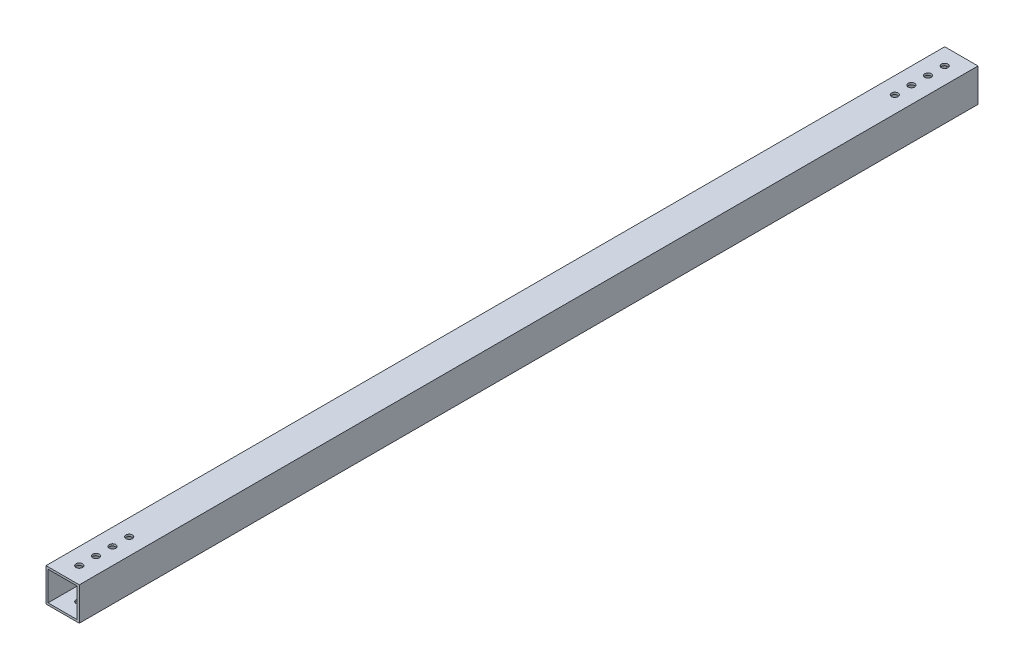
ISO-10303-21;
HEADER;
FILE_DESCRIPTION(('STEP AP214'),'2;1');
FILE_NAME('part.step','',(''),(''),'','','');
FILE_SCHEMA(('AUTOMOTIVE_DESIGN { 1 0 10303 214 1 1 1 1 }'));
ENDSEC;
DATA;
#1=APPLICATION_CONTEXT('core data for automotive mechanical design processes');
#2=APPLICATION_PROTOCOL_DEFINITION('international standard','automotive_design',2000,#1);
#3=PRODUCT_CONTEXT('',#1,'mechanical');
#4=PRODUCT('Part','Part','',(#3));
#5=PRODUCT_RELATED_PRODUCT_CATEGORY('part','',(#4));
#6=PRODUCT_DEFINITION_FORMATION('','',#4);
#7=PRODUCT_DEFINITION_CONTEXT('part definition',#1,'design');
#8=PRODUCT_DEFINITION('design','',#6,#7);
#9=PRODUCT_DEFINITION_SHAPE('','',#8);
#10=(LENGTH_UNIT() NAMED_UNIT(*) SI_UNIT(.MILLI.,.METRE.));
#11=(NAMED_UNIT(*) PLANE_ANGLE_UNIT() SI_UNIT($,.RADIAN.));
#12=(NAMED_UNIT(*) SI_UNIT($,.STERADIAN.) SOLID_ANGLE_UNIT());
#13=UNCERTAINTY_MEASURE_WITH_UNIT(LENGTH_MEASURE(1.E-05),#10,'distance_accuracy_value','');
#14=(GEOMETRIC_REPRESENTATION_CONTEXT(3) GLOBAL_UNCERTAINTY_ASSIGNED_CONTEXT((#13)) GLOBAL_UNIT_ASSIGNED_CONTEXT((#10,
#11,#12)) REPRESENTATION_CONTEXT('',''));
#15=CARTESIAN_POINT('',(0.,0.,0.));
#16=DIRECTION('',(0.,0.,1.));
#17=DIRECTION('',(1.,0.,0.));
#18=AXIS2_PLACEMENT_3D('',#15,#16,#17);
#19=CARTESIAN_POINT('',(0.,0.,342.9));
#20=DIRECTION('',(0.,0.,-1.));
#21=DIRECTION('',(-1.,0.,0.));
#22=AXIS2_PLACEMENT_3D('',#19,#20,#21);
#23=PLANE('',#22);
#24=DIRECTION('',(0.,1.,0.));
#25=VECTOR('',#24,1.);
#26=CARTESIAN_POINT('',(12.7,-12.7,342.9));
#27=LINE('',#26,#25);
#28=CARTESIAN_POINT('',(12.7,-12.7,342.9));
#29=VERTEX_POINT('',#28);
#30=CARTESIAN_POINT('',(12.7,12.7,342.9));
#31=VERTEX_POINT('',#30);
#32=EDGE_CURVE('E157',#29,#31,#27,.T.);
#33=ORIENTED_EDGE('',*,*,#32,.T.);
#34=DIRECTION('',(-1.,0.,0.));
#35=VECTOR('',#34,1.);
#36=CARTESIAN_POINT('',(-12.7,12.7,342.9));
#37=LINE('',#36,#35);
#38=CARTESIAN_POINT('',(-12.7,12.7,342.9));
#39=VERTEX_POINT('',#38);
#40=EDGE_CURVE('E161',#31,#39,#37,.T.);
#41=ORIENTED_EDGE('',*,*,#40,.T.);
#42=DIRECTION('',(0.,-1.,0.));
#43=VECTOR('',#42,1.);
#44=CARTESIAN_POINT('',(-12.7,-12.7,342.9));
#45=LINE('',#44,#43);
#46=CARTESIAN_POINT('',(-12.7,-12.7,342.9));
#47=VERTEX_POINT('',#46);
#48=EDGE_CURVE('E165',#39,#47,#45,.T.);
#49=ORIENTED_EDGE('',*,*,#48,.T.);
#50=DIRECTION('',(1.,0.,0.));
#51=VECTOR('',#50,1.);
#52=CARTESIAN_POINT('',(-12.7,-12.7,342.9));
#53=LINE('',#52,#51);
#54=EDGE_CURVE('E168',#47,#29,#53,.T.);
#55=ORIENTED_EDGE('',*,*,#54,.T.);
#56=EDGE_LOOP('',(#33,#41,#49,#55));
#57=FACE_BOUND('',#56,.T.);
#58=DIRECTION('',(0.,1.,0.));
#59=VECTOR('',#58,1.);
#60=CARTESIAN_POINT('',(11.1125,0.,342.9));
#61=LINE('',#60,#59);
#62=CARTESIAN_POINT('',(11.1125,-11.1125,342.9));
#63=VERTEX_POINT('',#62);
#64=CARTESIAN_POINT('',(11.1125,11.1125,342.9));
#65=VERTEX_POINT('',#64);
#66=EDGE_CURVE('E138',#63,#65,#61,.T.);
#67=ORIENTED_EDGE('',*,*,#66,.F.);
#68=DIRECTION('',(1.,0.,0.));
#69=VECTOR('',#68,1.);
#70=CARTESIAN_POINT('',(0.,-11.1125,342.9));
#71=LINE('',#70,#69);
#72=CARTESIAN_POINT('',(-11.1125,-11.1125,342.9));
#73=VERTEX_POINT('',#72);
#74=EDGE_CURVE('E119',#73,#63,#71,.T.);
#75=ORIENTED_EDGE('',*,*,#74,.F.);
#76=DIRECTION('',(0.,-1.,0.));
#77=VECTOR('',#76,1.);
#78=CARTESIAN_POINT('',(-11.1125,0.,342.9));
#79=LINE('',#78,#77);
#80=CARTESIAN_POINT('',(-11.1125,11.1125,342.9));
#81=VERTEX_POINT('',#80);
#82=EDGE_CURVE('E152',#81,#73,#79,.T.);
#83=ORIENTED_EDGE('',*,*,#82,.F.);
#84=DIRECTION('',(-1.,0.,0.));
#85=VECTOR('',#84,1.);
#86=CARTESIAN_POINT('',(0.,11.1125,342.9));
#87=LINE('',#86,#85);
#88=EDGE_CURVE('E143',#65,#81,#87,.T.);
#89=ORIENTED_EDGE('',*,*,#88,.F.);
#90=EDGE_LOOP('',(#67,#75,#83,#89));
#91=FACE_BOUND('',#90,.T.);
#92=ADVANCED_FACE('F46',(#57,#91),#23,.F.);
#93=CARTESIAN_POINT('',(0.,0.,-342.9));
#94=DIRECTION('',(0.,0.,-1.));
#95=DIRECTION('',(-1.,0.,0.));
#96=AXIS2_PLACEMENT_3D('',#93,#94,#95);
#97=PLANE('',#96);
#98=DIRECTION('',(0.,1.,0.));
#99=VECTOR('',#98,1.);
#100=CARTESIAN_POINT('',(12.7,-12.7,-342.9));
#101=LINE('',#100,#99);
#102=CARTESIAN_POINT('',(12.7,-12.7,-342.9));
#103=VERTEX_POINT('',#102);
#104=CARTESIAN_POINT('',(12.7,12.7,-342.9));
#105=VERTEX_POINT('',#104);
#106=EDGE_CURVE('E172',#103,#105,#101,.T.);
#107=ORIENTED_EDGE('',*,*,#106,.F.);
#108=DIRECTION('',(1.,0.,0.));
#109=VECTOR('',#108,1.);
#110=CARTESIAN_POINT('',(-12.7,-12.7,-342.9));
#111=LINE('',#110,#109);
#112=CARTESIAN_POINT('',(-12.7,-12.7,-342.9));
#113=VERTEX_POINT('',#112);
#114=EDGE_CURVE('E162',#113,#103,#111,.T.);
#115=ORIENTED_EDGE('',*,*,#114,.F.);
#116=DIRECTION('',(0.,-1.,0.));
#117=VECTOR('',#116,1.);
#118=CARTESIAN_POINT('',(-12.7,-12.7,-342.9));
#119=LINE('',#118,#117);
#120=CARTESIAN_POINT('',(-12.7,12.7,-342.9));
#121=VERTEX_POINT('',#120);
#122=EDGE_CURVE('E179',#121,#113,#119,.T.);
#123=ORIENTED_EDGE('',*,*,#122,.F.);
#124=DIRECTION('',(-1.,0.,0.));
#125=VECTOR('',#124,1.);
#126=CARTESIAN_POINT('',(-12.7,12.7,-342.9));
#127=LINE('',#126,#125);
#128=EDGE_CURVE('E176',#105,#121,#127,.T.);
#129=ORIENTED_EDGE('',*,*,#128,.F.);
#130=EDGE_LOOP('',(#107,#115,#123,#129));
#131=FACE_BOUND('',#130,.T.);
#132=DIRECTION('',(1.,0.,0.));
#133=VECTOR('',#132,1.);
#134=CARTESIAN_POINT('',(0.,-11.1125,-342.9));
#135=LINE('',#134,#133);
#136=CARTESIAN_POINT('',(-11.1125,-11.1125,-342.9));
#137=VERTEX_POINT('',#136);
#138=CARTESIAN_POINT('',(11.1125,-11.1125,-342.9));
#139=VERTEX_POINT('',#138);
#140=EDGE_CURVE('E117',#137,#139,#135,.T.);
#141=ORIENTED_EDGE('',*,*,#140,.T.);
#142=DIRECTION('',(0.,1.,0.));
#143=VECTOR('',#142,1.);
#144=CARTESIAN_POINT('',(11.1125,0.,-342.9));
#145=LINE('',#144,#143);
#146=CARTESIAN_POINT('',(11.1125,11.1125,-342.9));
#147=VERTEX_POINT('',#146);
#148=EDGE_CURVE('E126',#139,#147,#145,.T.);
#149=ORIENTED_EDGE('',*,*,#148,.T.);
#150=DIRECTION('',(-1.,0.,0.));
#151=VECTOR('',#150,1.);
#152=CARTESIAN_POINT('',(0.,11.1125,-342.9));
#153=LINE('',#152,#151);
#154=CARTESIAN_POINT('',(-11.1125,11.1125,-342.9));
#155=VERTEX_POINT('',#154);
#156=EDGE_CURVE('E133',#147,#155,#153,.T.);
#157=ORIENTED_EDGE('',*,*,#156,.T.);
#158=DIRECTION('',(0.,-1.,0.));
#159=VECTOR('',#158,1.);
#160=CARTESIAN_POINT('',(-11.1125,0.,-342.9));
#161=LINE('',#160,#159);
#162=EDGE_CURVE('E71',#155,#137,#161,.T.);
#163=ORIENTED_EDGE('',*,*,#162,.T.);
#164=EDGE_LOOP('',(#141,#149,#157,#163));
#165=FACE_BOUND('',#164,.T.);
#166=ADVANCED_FACE('F136',(#131,#165),#97,.T.);
#167=CARTESIAN_POINT('',(12.7,-12.7,342.9));
#168=DIRECTION('',(-1.,0.,0.));
#169=DIRECTION('',(0.,0.,1.));
#170=AXIS2_PLACEMENT_3D('',#167,#168,#169);
#171=PLANE('',#170);
#172=ORIENTED_EDGE('',*,*,#106,.T.);
#173=DIRECTION('',(0.,0.,-1.));
#174=VECTOR('',#173,1.);
#175=CARTESIAN_POINT('',(12.7,12.7,342.9));
#176=LINE('',#175,#174);
#177=EDGE_CURVE('E11',#31,#105,#176,.T.);
#178=ORIENTED_EDGE('',*,*,#177,.F.);
#179=ORIENTED_EDGE('',*,*,#32,.F.);
#180=DIRECTION('',(0.,0.,-1.));
#181=VECTOR('',#180,1.);
#182=CARTESIAN_POINT('',(12.7,-12.7,342.9));
#183=LINE('',#182,#181);
#184=EDGE_CURVE('E171',#29,#103,#183,.T.);
#185=ORIENTED_EDGE('',*,*,#184,.T.);
#186=EDGE_LOOP('',(#172,#178,#179,#185));
#187=FACE_BOUND('',#186,.T.);
#188=ADVANCED_FACE('F48',(#187),#171,.F.);
#189=CARTESIAN_POINT('',(-12.7,12.7,342.9));
#190=DIRECTION('',(0.,-1.,0.));
#191=DIRECTION('',(0.,0.,-1.));
#192=AXIS2_PLACEMENT_3D('',#189,#190,#191);
#193=PLANE('',#192);
#194=CARTESIAN_POINT('',(0.,12.7,-330.2));
#195=DIRECTION('',(0.,-1.,0.));
#196=DIRECTION('',(0.,0.,-1.));
#197=AXIS2_PLACEMENT_3D('',#194,#195,#196);
#198=CIRCLE('',#197,2.48920000000001);
#199=CARTESIAN_POINT('',(0.,12.7,-332.6892));
#200=VERTEX_POINT('',#199);
#201=EDGE_CURVE('E341',#200,#200,#198,.T.);
#202=ORIENTED_EDGE('',*,*,#201,.T.);
#203=EDGE_LOOP('',(#202));
#204=FACE_BOUND('',#203,.T.);
#205=CARTESIAN_POINT('',(0.,12.7,-317.5));
#206=DIRECTION('',(0.,-1.,0.));
#207=DIRECTION('',(0.,0.,-1.));
#208=AXIS2_PLACEMENT_3D('',#205,#206,#207);
#209=CIRCLE('',#208,2.48920000000001);
#210=CARTESIAN_POINT('',(0.,12.7,-319.9892));
#211=VERTEX_POINT('',#210);
#212=EDGE_CURVE('E345',#211,#211,#209,.T.);
#213=ORIENTED_EDGE('',*,*,#212,.T.);
#214=EDGE_LOOP('',(#213));
#215=FACE_BOUND('',#214,.T.);
#216=CARTESIAN_POINT('',(0.,12.7,-304.8));
#217=DIRECTION('',(0.,-1.,0.));
#218=DIRECTION('',(0.,0.,-1.));
#219=AXIS2_PLACEMENT_3D('',#216,#217,#218);
#220=CIRCLE('',#219,2.48920000000001);
#221=CARTESIAN_POINT('',(0.,12.7,-307.2892));
#222=VERTEX_POINT('',#221);
#223=EDGE_CURVE('E349',#222,#222,#220,.T.);
#224=ORIENTED_EDGE('',*,*,#223,.T.);
#225=EDGE_LOOP('',(#224));
#226=FACE_BOUND('',#225,.T.);
#227=CARTESIAN_POINT('',(0.,12.7,-292.1));
#228=DIRECTION('',(0.,-1.,0.));
#229=DIRECTION('',(0.,0.,-1.));
#230=AXIS2_PLACEMENT_3D('',#227,#228,#229);
#231=CIRCLE('',#230,2.48920000000002);
#232=CARTESIAN_POINT('',(0.,12.7,-294.5892));
#233=VERTEX_POINT('',#232);
#234=EDGE_CURVE('E353',#233,#233,#231,.T.);
#235=ORIENTED_EDGE('',*,*,#234,.T.);
#236=EDGE_LOOP('',(#235));
#237=FACE_BOUND('',#236,.T.);
#238=CARTESIAN_POINT('',(0.,12.7,330.2));
#239=DIRECTION('',(0.,1.,0.));
#240=DIRECTION('',(0.,0.,1.));
#241=AXIS2_PLACEMENT_3D('',#238,#239,#240);
#242=CIRCLE('',#241,2.48920000000001);
#243=CARTESIAN_POINT('',(0.,12.7,332.6892));
#244=VERTEX_POINT('',#243);
#245=EDGE_CURVE('E248',#244,#244,#242,.T.);
#246=ORIENTED_EDGE('',*,*,#245,.F.);
#247=EDGE_LOOP('',(#246));
#248=FACE_BOUND('',#247,.T.);
#249=CARTESIAN_POINT('',(0.,12.7,317.5));
#250=DIRECTION('',(0.,1.,0.));
#251=DIRECTION('',(0.,0.,1.));
#252=AXIS2_PLACEMENT_3D('',#249,#250,#251);
#253=CIRCLE('',#252,2.48920000000001);
#254=CARTESIAN_POINT('',(0.,12.7,319.9892));
#255=VERTEX_POINT('',#254);
#256=EDGE_CURVE('E252',#255,#255,#253,.T.);
#257=ORIENTED_EDGE('',*,*,#256,.F.);
#258=EDGE_LOOP('',(#257));
#259=FACE_BOUND('',#258,.T.);
#260=CARTESIAN_POINT('',(0.,12.7,304.8));
#261=DIRECTION('',(0.,1.,0.));
#262=DIRECTION('',(0.,0.,1.));
#263=AXIS2_PLACEMENT_3D('',#260,#261,#262);
#264=CIRCLE('',#263,2.48920000000001);
#265=CARTESIAN_POINT('',(0.,12.7,307.2892));
#266=VERTEX_POINT('',#265);
#267=EDGE_CURVE('E260',#266,#266,#264,.T.);
#268=ORIENTED_EDGE('',*,*,#267,.F.);
#269=EDGE_LOOP('',(#268));
#270=FACE_BOUND('',#269,.T.);
#271=CARTESIAN_POINT('',(0.,12.7,292.1));
#272=DIRECTION('',(0.,1.,0.));
#273=DIRECTION('',(0.,0.,1.));
#274=AXIS2_PLACEMENT_3D('',#271,#272,#273);
#275=CIRCLE('',#274,2.48920000000002);
#276=CARTESIAN_POINT('',(0.,12.7,294.5892));
#277=VERTEX_POINT('',#276);
#278=EDGE_CURVE('E268',#277,#277,#275,.T.);
#279=ORIENTED_EDGE('',*,*,#278,.F.);
#280=EDGE_LOOP('',(#279));
#281=FACE_BOUND('',#280,.T.);
#282=ORIENTED_EDGE('',*,*,#128,.T.);
#283=DIRECTION('',(0.,0.,-1.));
#284=VECTOR('',#283,1.);
#285=CARTESIAN_POINT('',(-12.7,12.7,342.9));
#286=LINE('',#285,#284);
#287=EDGE_CURVE('E56',#39,#121,#286,.T.);
#288=ORIENTED_EDGE('',*,*,#287,.F.);
#289=ORIENTED_EDGE('',*,*,#40,.F.);
#290=ORIENTED_EDGE('',*,*,#177,.T.);
#291=EDGE_LOOP('',(#282,#288,#289,#290));
#292=FACE_BOUND('',#291,.T.);
#293=ADVANCED_FACE('F329',(#204,#215,#226,#237,#248,#259,#270,#281,#292),#193,.F.);
#294=CARTESIAN_POINT('',(-12.7,-12.7,342.9));
#295=DIRECTION('',(1.,0.,0.));
#296=DIRECTION('',(0.,0.,-1.));
#297=AXIS2_PLACEMENT_3D('',#294,#295,#296);
#298=PLANE('',#297);
#299=ORIENTED_EDGE('',*,*,#122,.T.);
#300=DIRECTION('',(0.,0.,-1.));
#301=VECTOR('',#300,1.);
#302=CARTESIAN_POINT('',(-12.7,-12.7,342.9));
#303=LINE('',#302,#301);
#304=EDGE_CURVE('E187',#47,#113,#303,.T.);
#305=ORIENTED_EDGE('',*,*,#304,.F.);
#306=ORIENTED_EDGE('',*,*,#48,.F.);
#307=ORIENTED_EDGE('',*,*,#287,.T.);
#308=EDGE_LOOP('',(#299,#305,#306,#307));
#309=FACE_BOUND('',#308,.T.);
#310=ADVANCED_FACE('F327',(#309),#298,.F.);
#311=CARTESIAN_POINT('',(-12.7,-12.7,342.9));
#312=DIRECTION('',(0.,1.,0.));
#313=DIRECTION('',(0.,0.,1.));
#314=AXIS2_PLACEMENT_3D('',#311,#312,#313);
#315=PLANE('',#314);
#316=CARTESIAN_POINT('',(0.,-12.7,-330.2));
#317=DIRECTION('',(0.,-1.,0.));
#318=DIRECTION('',(0.,0.,-1.));
#319=AXIS2_PLACEMENT_3D('',#316,#317,#318);
#320=CIRCLE('',#319,2.48920000000001);
#321=CARTESIAN_POINT('',(0.,-12.7,-332.6892));
#322=VERTEX_POINT('',#321);
#323=EDGE_CURVE('E219',#322,#322,#320,.T.);
#324=ORIENTED_EDGE('',*,*,#323,.F.);
#325=EDGE_LOOP('',(#324));
#326=FACE_BOUND('',#325,.T.);
#327=CARTESIAN_POINT('',(0.,-12.7,-317.5));
#328=DIRECTION('',(0.,-1.,0.));
#329=DIRECTION('',(0.,0.,-1.));
#330=AXIS2_PLACEMENT_3D('',#327,#328,#329);
#331=CIRCLE('',#330,2.48920000000001);
#332=CARTESIAN_POINT('',(0.,-12.7,-319.9892));
#333=VERTEX_POINT('',#332);
#334=EDGE_CURVE('E480',#333,#333,#331,.T.);
#335=ORIENTED_EDGE('',*,*,#334,.F.);
#336=EDGE_LOOP('',(#335));
#337=FACE_BOUND('',#336,.T.);
#338=CARTESIAN_POINT('',(0.,-12.7,-304.8));
#339=DIRECTION('',(0.,-1.,0.));
#340=DIRECTION('',(0.,0.,-1.));
#341=AXIS2_PLACEMENT_3D('',#338,#339,#340);
#342=CIRCLE('',#341,2.48920000000001);
#343=CARTESIAN_POINT('',(0.,-12.7,-307.2892));
#344=VERTEX_POINT('',#343);
#345=EDGE_CURVE('E491',#344,#344,#342,.T.);
#346=ORIENTED_EDGE('',*,*,#345,.F.);
#347=EDGE_LOOP('',(#346));
#348=FACE_BOUND('',#347,.T.);
#349=CARTESIAN_POINT('',(0.,-12.7,-292.1));
#350=DIRECTION('',(0.,-1.,0.));
#351=DIRECTION('',(0.,0.,-1.));
#352=AXIS2_PLACEMENT_3D('',#349,#350,#351);
#353=CIRCLE('',#352,2.48920000000002);
#354=CARTESIAN_POINT('',(0.,-12.7,-294.5892));
#355=VERTEX_POINT('',#354);
#356=EDGE_CURVE('E495',#355,#355,#353,.T.);
#357=ORIENTED_EDGE('',*,*,#356,.F.);
#358=EDGE_LOOP('',(#357));
#359=FACE_BOUND('',#358,.T.);
#360=CARTESIAN_POINT('',(0.,-12.7,330.2));
#361=DIRECTION('',(0.,1.,0.));
#362=DIRECTION('',(0.,0.,1.));
#363=AXIS2_PLACEMENT_3D('',#360,#361,#362);
#364=CIRCLE('',#363,2.48920000000001);
#365=CARTESIAN_POINT('',(0.,-12.7,332.6892));
#366=VERTEX_POINT('',#365);
#367=EDGE_CURVE('E199',#366,#366,#364,.T.);
#368=ORIENTED_EDGE('',*,*,#367,.T.);
#369=EDGE_LOOP('',(#368));
#370=FACE_BOUND('',#369,.T.);
#371=CARTESIAN_POINT('',(0.,-12.7,317.5));
#372=DIRECTION('',(0.,1.,0.));
#373=DIRECTION('',(0.,0.,1.));
#374=AXIS2_PLACEMENT_3D('',#371,#372,#373);
#375=CIRCLE('',#374,2.48920000000001);
#376=CARTESIAN_POINT('',(0.,-12.7,319.9892));
#377=VERTEX_POINT('',#376);
#378=EDGE_CURVE('E256',#377,#377,#375,.T.);
#379=ORIENTED_EDGE('',*,*,#378,.T.);
#380=EDGE_LOOP('',(#379));
#381=FACE_BOUND('',#380,.T.);
#382=CARTESIAN_POINT('',(0.,-12.7,304.8));
#383=DIRECTION('',(0.,1.,0.));
#384=DIRECTION('',(0.,0.,1.));
#385=AXIS2_PLACEMENT_3D('',#382,#383,#384);
#386=CIRCLE('',#385,2.48920000000001);
#387=CARTESIAN_POINT('',(0.,-12.7,307.2892));
#388=VERTEX_POINT('',#387);
#389=EDGE_CURVE('E264',#388,#388,#386,.T.);
#390=ORIENTED_EDGE('',*,*,#389,.T.);
#391=EDGE_LOOP('',(#390));
#392=FACE_BOUND('',#391,.T.);
#393=CARTESIAN_POINT('',(0.,-12.7,292.1));
#394=DIRECTION('',(0.,1.,0.));
#395=DIRECTION('',(0.,0.,1.));
#396=AXIS2_PLACEMENT_3D('',#393,#394,#395);
#397=CIRCLE('',#396,2.48920000000002);
#398=CARTESIAN_POINT('',(0.,-12.7,294.5892));
#399=VERTEX_POINT('',#398);
#400=EDGE_CURVE('E247',#399,#399,#397,.T.);
#401=ORIENTED_EDGE('',*,*,#400,.T.);
#402=EDGE_LOOP('',(#401));
#403=FACE_BOUND('',#402,.T.);
#404=ORIENTED_EDGE('',*,*,#114,.T.);
#405=ORIENTED_EDGE('',*,*,#184,.F.);
#406=ORIENTED_EDGE('',*,*,#54,.F.);
#407=ORIENTED_EDGE('',*,*,#304,.T.);
#408=EDGE_LOOP('',(#404,#405,#406,#407));
#409=FACE_BOUND('',#408,.T.);
#410=ADVANCED_FACE('F312',(#326,#337,#348,#359,#370,#381,#392,#403,#409),#315,.F.);
#411=CARTESIAN_POINT('',(11.1125,-12.7,342.9));
#412=DIRECTION('',(-1.,0.,0.));
#413=DIRECTION('',(0.,0.,1.));
#414=AXIS2_PLACEMENT_3D('',#411,#412,#413);
#415=PLANE('',#414);
#416=ORIENTED_EDGE('',*,*,#148,.F.);
#417=DIRECTION('',(0.,0.,-1.));
#418=VECTOR('',#417,1.);
#419=CARTESIAN_POINT('',(11.1125,-11.1125,342.9));
#420=LINE('',#419,#418);
#421=EDGE_CURVE('E113',#63,#139,#420,.T.);
#422=ORIENTED_EDGE('',*,*,#421,.F.);
#423=ORIENTED_EDGE('',*,*,#66,.T.);
#424=DIRECTION('',(0.,0.,-1.));
#425=VECTOR('',#424,1.);
#426=CARTESIAN_POINT('',(11.1125,11.1125,342.9));
#427=LINE('',#426,#425);
#428=EDGE_CURVE('E129',#65,#147,#427,.T.);
#429=ORIENTED_EDGE('',*,*,#428,.T.);
#430=EDGE_LOOP('',(#416,#422,#423,#429));
#431=FACE_BOUND('',#430,.T.);
#432=ADVANCED_FACE('F127',(#431),#415,.T.);
#433=CARTESIAN_POINT('',(-12.7,11.1125,342.9));
#434=DIRECTION('',(0.,-1.,0.));
#435=DIRECTION('',(0.,0.,-1.));
#436=AXIS2_PLACEMENT_3D('',#433,#434,#435);
#437=PLANE('',#436);
#438=CARTESIAN_POINT('',(0.,11.1125,-330.2));
#439=DIRECTION('',(0.,-1.,0.));
#440=DIRECTION('',(0.,0.,-1.));
#441=AXIS2_PLACEMENT_3D('',#438,#439,#440);
#442=CIRCLE('',#441,2.48920000000001);
#443=CARTESIAN_POINT('',(0.,11.1125,-332.6892));
#444=VERTEX_POINT('',#443);
#445=EDGE_CURVE('E243',#444,#444,#442,.F.);
#446=ORIENTED_EDGE('',*,*,#445,.T.);
#447=EDGE_LOOP('',(#446));
#448=FACE_BOUND('',#447,.T.);
#449=CARTESIAN_POINT('',(0.,11.1125,-317.5));
#450=DIRECTION('',(0.,-1.,0.));
#451=DIRECTION('',(0.,0.,-1.));
#452=AXIS2_PLACEMENT_3D('',#449,#450,#451);
#453=CIRCLE('',#452,2.48920000000001);
#454=CARTESIAN_POINT('',(0.,11.1125,-319.9892));
#455=VERTEX_POINT('',#454);
#456=EDGE_CURVE('E227',#455,#455,#453,.F.);
#457=ORIENTED_EDGE('',*,*,#456,.T.);
#458=EDGE_LOOP('',(#457));
#459=FACE_BOUND('',#458,.T.);
#460=CARTESIAN_POINT('',(0.,11.1125,-304.8));
#461=DIRECTION('',(0.,-1.,0.));
#462=DIRECTION('',(0.,0.,-1.));
#463=AXIS2_PLACEMENT_3D('',#460,#461,#462);
#464=CIRCLE('',#463,2.48920000000001);
#465=CARTESIAN_POINT('',(0.,11.1125,-307.2892));
#466=VERTEX_POINT('',#465);
#467=EDGE_CURVE('E223',#466,#466,#464,.F.);
#468=ORIENTED_EDGE('',*,*,#467,.T.);
#469=EDGE_LOOP('',(#468));
#470=FACE_BOUND('',#469,.T.);
#471=CARTESIAN_POINT('',(0.,11.1125,-292.1));
#472=DIRECTION('',(0.,-1.,0.));
#473=DIRECTION('',(0.,0.,-1.));
#474=AXIS2_PLACEMENT_3D('',#471,#472,#473);
#475=CIRCLE('',#474,2.48920000000002);
#476=CARTESIAN_POINT('',(0.,11.1125,-294.5892));
#477=VERTEX_POINT('',#476);
#478=EDGE_CURVE('E218',#477,#477,#475,.F.);
#479=ORIENTED_EDGE('',*,*,#478,.T.);
#480=EDGE_LOOP('',(#479));
#481=FACE_BOUND('',#480,.T.);
#482=CARTESIAN_POINT('',(0.,11.1125,330.2));
#483=DIRECTION('',(0.,-1.,0.));
#484=DIRECTION('',(0.,0.,-1.));
#485=AXIS2_PLACEMENT_3D('',#482,#483,#484);
#486=CIRCLE('',#485,2.48920000000001);
#487=CARTESIAN_POINT('',(0.,11.1125,327.7108));
#488=VERTEX_POINT('',#487);
#489=EDGE_CURVE('E134',#488,#488,#486,.T.);
#490=ORIENTED_EDGE('',*,*,#489,.F.);
#491=EDGE_LOOP('',(#490));
#492=FACE_BOUND('',#491,.T.);
#493=CARTESIAN_POINT('',(0.,11.1125,317.5));
#494=DIRECTION('',(0.,-1.,0.));
#495=DIRECTION('',(0.,0.,-1.));
#496=AXIS2_PLACEMENT_3D('',#493,#494,#495);
#497=CIRCLE('',#496,2.48920000000001);
#498=CARTESIAN_POINT('',(0.,11.1125,315.0108));
#499=VERTEX_POINT('',#498);
#500=EDGE_CURVE('E209',#499,#499,#497,.T.);
#501=ORIENTED_EDGE('',*,*,#500,.F.);
#502=EDGE_LOOP('',(#501));
#503=FACE_BOUND('',#502,.T.);
#504=CARTESIAN_POINT('',(0.,11.1125,304.8));
#505=DIRECTION('',(0.,-1.,0.));
#506=DIRECTION('',(0.,0.,-1.));
#507=AXIS2_PLACEMENT_3D('',#504,#505,#506);
#508=CIRCLE('',#507,2.48920000000001);
#509=CARTESIAN_POINT('',(0.,11.1125,302.3108));
#510=VERTEX_POINT('',#509);
#511=EDGE_CURVE('E204',#510,#510,#508,.T.);
#512=ORIENTED_EDGE('',*,*,#511,.F.);
#513=EDGE_LOOP('',(#512));
#514=FACE_BOUND('',#513,.T.);
#515=CARTESIAN_POINT('',(0.,11.1125,292.1));
#516=DIRECTION('',(0.,-1.,0.));
#517=DIRECTION('',(0.,0.,-1.));
#518=AXIS2_PLACEMENT_3D('',#515,#516,#517);
#519=CIRCLE('',#518,2.48920000000002);
#520=CARTESIAN_POINT('',(0.,11.1125,289.6108));
#521=VERTEX_POINT('',#520);
#522=EDGE_CURVE('E198',#521,#521,#519,.T.);
#523=ORIENTED_EDGE('',*,*,#522,.F.);
#524=EDGE_LOOP('',(#523));
#525=FACE_BOUND('',#524,.T.);
#526=ORIENTED_EDGE('',*,*,#156,.F.);
#527=ORIENTED_EDGE('',*,*,#428,.F.);
#528=ORIENTED_EDGE('',*,*,#88,.T.);
#529=DIRECTION('',(0.,0.,-1.));
#530=VECTOR('',#529,1.);
#531=CARTESIAN_POINT('',(-11.1125,11.1125,342.9));
#532=LINE('',#531,#530);
#533=EDGE_CURVE('E291',#81,#155,#532,.T.);
#534=ORIENTED_EDGE('',*,*,#533,.T.);
#535=EDGE_LOOP('',(#526,#527,#528,#534));
#536=FACE_BOUND('',#535,.T.);
#537=ADVANCED_FACE('F301',(#448,#459,#470,#481,#492,#503,#514,#525,#536),#437,.T.);
#538=CARTESIAN_POINT('',(-11.1125,-12.7,342.9));
#539=DIRECTION('',(1.,0.,0.));
#540=DIRECTION('',(0.,0.,-1.));
#541=AXIS2_PLACEMENT_3D('',#538,#539,#540);
#542=PLANE('',#541);
#543=ORIENTED_EDGE('',*,*,#162,.F.);
#544=ORIENTED_EDGE('',*,*,#533,.F.);
#545=ORIENTED_EDGE('',*,*,#82,.T.);
#546=DIRECTION('',(0.,0.,-1.));
#547=VECTOR('',#546,1.);
#548=CARTESIAN_POINT('',(-11.1125,-11.1125,342.9));
#549=LINE('',#548,#547);
#550=EDGE_CURVE('E64',#73,#137,#549,.T.);
#551=ORIENTED_EDGE('',*,*,#550,.T.);
#552=EDGE_LOOP('',(#543,#544,#545,#551));
#553=FACE_BOUND('',#552,.T.);
#554=ADVANCED_FACE('F296',(#553),#542,.T.);
#555=CARTESIAN_POINT('',(-12.7,-11.1125,342.9));
#556=DIRECTION('',(0.,1.,0.));
#557=DIRECTION('',(0.,0.,1.));
#558=AXIS2_PLACEMENT_3D('',#555,#556,#557);
#559=PLANE('',#558);
#560=CARTESIAN_POINT('',(0.,-11.1125,-330.2));
#561=DIRECTION('',(0.,1.,0.));
#562=DIRECTION('',(0.,0.,1.));
#563=AXIS2_PLACEMENT_3D('',#560,#561,#562);
#564=CIRCLE('',#563,2.48920000000001);
#565=CARTESIAN_POINT('',(0.,-11.1125,-327.7108));
#566=VERTEX_POINT('',#565);
#567=EDGE_CURVE('E50',#566,#566,#564,.F.);
#568=ORIENTED_EDGE('',*,*,#567,.T.);
#569=EDGE_LOOP('',(#568));
#570=FACE_BOUND('',#569,.T.);
#571=CARTESIAN_POINT('',(0.,-11.1125,-317.5));
#572=DIRECTION('',(0.,1.,0.));
#573=DIRECTION('',(0.,0.,1.));
#574=AXIS2_PLACEMENT_3D('',#571,#572,#573);
#575=CIRCLE('',#574,2.48920000000001);
#576=CARTESIAN_POINT('',(0.,-11.1125,-315.0108));
#577=VERTEX_POINT('',#576);
#578=EDGE_CURVE('E224',#577,#577,#575,.F.);
#579=ORIENTED_EDGE('',*,*,#578,.T.);
#580=EDGE_LOOP('',(#579));
#581=FACE_BOUND('',#580,.T.);
#582=CARTESIAN_POINT('',(0.,-11.1125,-304.8));
#583=DIRECTION('',(0.,1.,0.));
#584=DIRECTION('',(0.,0.,1.));
#585=AXIS2_PLACEMENT_3D('',#582,#583,#584);
#586=CIRCLE('',#585,2.48920000000001);
#587=CARTESIAN_POINT('',(0.,-11.1125,-302.3108));
#588=VERTEX_POINT('',#587);
#589=EDGE_CURVE('E220',#588,#588,#586,.F.);
#590=ORIENTED_EDGE('',*,*,#589,.T.);
#591=EDGE_LOOP('',(#590));
#592=FACE_BOUND('',#591,.T.);
#593=CARTESIAN_POINT('',(0.,-11.1125,-292.1));
#594=DIRECTION('',(0.,1.,0.));
#595=DIRECTION('',(0.,0.,1.));
#596=AXIS2_PLACEMENT_3D('',#593,#594,#595);
#597=CIRCLE('',#596,2.48920000000002);
#598=CARTESIAN_POINT('',(0.,-11.1125,-289.6108));
#599=VERTEX_POINT('',#598);
#600=EDGE_CURVE('E214',#599,#599,#597,.F.);
#601=ORIENTED_EDGE('',*,*,#600,.T.);
#602=EDGE_LOOP('',(#601));
#603=FACE_BOUND('',#602,.T.);
#604=CARTESIAN_POINT('',(0.,-11.1125,330.2));
#605=DIRECTION('',(0.,1.,0.));
#606=DIRECTION('',(0.,0.,1.));
#607=AXIS2_PLACEMENT_3D('',#604,#605,#606);
#608=CIRCLE('',#607,2.48920000000001);
#609=CARTESIAN_POINT('',(0.,-11.1125,332.6892));
#610=VERTEX_POINT('',#609);
#611=EDGE_CURVE('E210',#610,#610,#608,.T.);
#612=ORIENTED_EDGE('',*,*,#611,.F.);
#613=EDGE_LOOP('',(#612));
#614=FACE_BOUND('',#613,.T.);
#615=CARTESIAN_POINT('',(0.,-11.1125,317.5));
#616=DIRECTION('',(0.,1.,0.));
#617=DIRECTION('',(0.,0.,1.));
#618=AXIS2_PLACEMENT_3D('',#615,#616,#617);
#619=CIRCLE('',#618,2.48920000000001);
#620=CARTESIAN_POINT('',(0.,-11.1125,319.9892));
#621=VERTEX_POINT('',#620);
#622=EDGE_CURVE('E205',#621,#621,#619,.T.);
#623=ORIENTED_EDGE('',*,*,#622,.F.);
#624=EDGE_LOOP('',(#623));
#625=FACE_BOUND('',#624,.T.);
#626=CARTESIAN_POINT('',(0.,-11.1125,304.8));
#627=DIRECTION('',(0.,1.,0.));
#628=DIRECTION('',(0.,0.,1.));
#629=AXIS2_PLACEMENT_3D('',#626,#627,#628);
#630=CIRCLE('',#629,2.48920000000001);
#631=CARTESIAN_POINT('',(0.,-11.1125,307.2892));
#632=VERTEX_POINT('',#631);
#633=EDGE_CURVE('E200',#632,#632,#630,.T.);
#634=ORIENTED_EDGE('',*,*,#633,.F.);
#635=EDGE_LOOP('',(#634));
#636=FACE_BOUND('',#635,.T.);
#637=CARTESIAN_POINT('',(0.,-11.1125,292.1));
#638=DIRECTION('',(0.,1.,0.));
#639=DIRECTION('',(0.,0.,1.));
#640=AXIS2_PLACEMENT_3D('',#637,#638,#639);
#641=CIRCLE('',#640,2.48920000000002);
#642=CARTESIAN_POINT('',(0.,-11.1125,294.5892));
#643=VERTEX_POINT('',#642);
#644=EDGE_CURVE('E194',#643,#643,#641,.T.);
#645=ORIENTED_EDGE('',*,*,#644,.F.);
#646=EDGE_LOOP('',(#645));
#647=FACE_BOUND('',#646,.T.);
#648=ORIENTED_EDGE('',*,*,#140,.F.);
#649=ORIENTED_EDGE('',*,*,#550,.F.);
#650=ORIENTED_EDGE('',*,*,#74,.T.);
#651=ORIENTED_EDGE('',*,*,#421,.T.);
#652=EDGE_LOOP('',(#648,#649,#650,#651));
#653=FACE_BOUND('',#652,.T.);
#654=ADVANCED_FACE('F115',(#570,#581,#592,#603,#614,#625,#636,#647,#653),#559,.T.);
#655=CARTESIAN_POINT('',(0.,-12.7,292.1));
#656=DIRECTION('',(0.,1.,0.));
#657=DIRECTION('',(0.,0.,1.));
#658=AXIS2_PLACEMENT_3D('',#655,#656,#657);
#659=CYLINDRICAL_SURFACE('',#658,2.48920000000002);
#660=ORIENTED_EDGE('',*,*,#644,.T.);
#661=EDGE_LOOP('',(#660));
#662=FACE_BOUND('',#661,.T.);
#663=ORIENTED_EDGE('',*,*,#400,.F.);
#664=EDGE_LOOP('',(#663));
#665=FACE_BOUND('',#664,.T.);
#666=ADVANCED_FACE('F380',(#662,#665),#659,.F.);
#667=CARTESIAN_POINT('',(0.,-12.7,304.8));
#668=DIRECTION('',(0.,1.,0.));
#669=DIRECTION('',(0.,0.,1.));
#670=AXIS2_PLACEMENT_3D('',#667,#668,#669);
#671=CYLINDRICAL_SURFACE('',#670,2.48920000000001);
#672=ORIENTED_EDGE('',*,*,#633,.T.);
#673=EDGE_LOOP('',(#672));
#674=FACE_BOUND('',#673,.T.);
#675=ORIENTED_EDGE('',*,*,#389,.F.);
#676=EDGE_LOOP('',(#675));
#677=FACE_BOUND('',#676,.T.);
#678=ADVANCED_FACE('F388',(#674,#677),#671,.F.);
#679=CARTESIAN_POINT('',(0.,-12.7,317.5));
#680=DIRECTION('',(0.,1.,0.));
#681=DIRECTION('',(0.,0.,1.));
#682=AXIS2_PLACEMENT_3D('',#679,#680,#681);
#683=CYLINDRICAL_SURFACE('',#682,2.48920000000001);
#684=ORIENTED_EDGE('',*,*,#622,.T.);
#685=EDGE_LOOP('',(#684));
#686=FACE_BOUND('',#685,.T.);
#687=ORIENTED_EDGE('',*,*,#378,.F.);
#688=EDGE_LOOP('',(#687));
#689=FACE_BOUND('',#688,.T.);
#690=ADVANCED_FACE('F389',(#686,#689),#683,.F.);
#691=CARTESIAN_POINT('',(0.,-12.7,330.2));
#692=DIRECTION('',(0.,1.,0.));
#693=DIRECTION('',(0.,0.,1.));
#694=AXIS2_PLACEMENT_3D('',#691,#692,#693);
#695=CYLINDRICAL_SURFACE('',#694,2.48920000000001);
#696=ORIENTED_EDGE('',*,*,#611,.T.);
#697=EDGE_LOOP('',(#696));
#698=FACE_BOUND('',#697,.T.);
#699=ORIENTED_EDGE('',*,*,#367,.F.);
#700=EDGE_LOOP('',(#699));
#701=FACE_BOUND('',#700,.T.);
#702=ADVANCED_FACE('F377',(#698,#701),#695,.F.);
#703=ORIENTED_EDGE('',*,*,#522,.T.);
#704=EDGE_LOOP('',(#703));
#705=FACE_BOUND('',#704,.T.);
#706=ORIENTED_EDGE('',*,*,#278,.T.);
#707=EDGE_LOOP('',(#706));
#708=FACE_BOUND('',#707,.T.);
#709=ADVANCED_FACE('F374',(#705,#708),#659,.F.);
#710=ORIENTED_EDGE('',*,*,#511,.T.);
#711=EDGE_LOOP('',(#710));
#712=FACE_BOUND('',#711,.T.);
#713=ORIENTED_EDGE('',*,*,#267,.T.);
#714=EDGE_LOOP('',(#713));
#715=FACE_BOUND('',#714,.T.);
#716=ADVANCED_FACE('F376',(#712,#715),#671,.F.);
#717=ORIENTED_EDGE('',*,*,#500,.T.);
#718=EDGE_LOOP('',(#717));
#719=FACE_BOUND('',#718,.T.);
#720=ORIENTED_EDGE('',*,*,#256,.T.);
#721=EDGE_LOOP('',(#720));
#722=FACE_BOUND('',#721,.T.);
#723=ADVANCED_FACE('F385',(#719,#722),#683,.F.);
#724=ORIENTED_EDGE('',*,*,#489,.T.);
#725=EDGE_LOOP('',(#724));
#726=FACE_BOUND('',#725,.T.);
#727=ORIENTED_EDGE('',*,*,#245,.T.);
#728=EDGE_LOOP('',(#727));
#729=FACE_BOUND('',#728,.T.);
#730=ADVANCED_FACE('F392',(#726,#729),#695,.F.);
#731=CARTESIAN_POINT('',(0.,-12.7,-292.1));
#732=DIRECTION('',(0.,1.,0.));
#733=DIRECTION('',(0.,0.,1.));
#734=AXIS2_PLACEMENT_3D('',#731,#732,#733);
#735=CYLINDRICAL_SURFACE('',#734,2.48920000000002);
#736=ORIENTED_EDGE('',*,*,#600,.F.);
#737=EDGE_LOOP('',(#736));
#738=FACE_BOUND('',#737,.T.);
#739=ORIENTED_EDGE('',*,*,#356,.T.);
#740=EDGE_LOOP('',(#739));
#741=FACE_BOUND('',#740,.T.);
#742=ADVANCED_FACE('F435',(#738,#741),#735,.F.);
#743=CARTESIAN_POINT('',(0.,-12.7,-304.8));
#744=DIRECTION('',(0.,1.,0.));
#745=DIRECTION('',(0.,0.,1.));
#746=AXIS2_PLACEMENT_3D('',#743,#744,#745);
#747=CYLINDRICAL_SURFACE('',#746,2.48920000000001);
#748=ORIENTED_EDGE('',*,*,#589,.F.);
#749=EDGE_LOOP('',(#748));
#750=FACE_BOUND('',#749,.T.);
#751=ORIENTED_EDGE('',*,*,#345,.T.);
#752=EDGE_LOOP('',(#751));
#753=FACE_BOUND('',#752,.T.);
#754=ADVANCED_FACE('F447',(#750,#753),#747,.F.);
#755=CARTESIAN_POINT('',(0.,-12.7,-317.5));
#756=DIRECTION('',(0.,1.,0.));
#757=DIRECTION('',(0.,0.,1.));
#758=AXIS2_PLACEMENT_3D('',#755,#756,#757);
#759=CYLINDRICAL_SURFACE('',#758,2.48920000000001);
#760=ORIENTED_EDGE('',*,*,#578,.F.);
#761=EDGE_LOOP('',(#760));
#762=FACE_BOUND('',#761,.T.);
#763=ORIENTED_EDGE('',*,*,#334,.T.);
#764=EDGE_LOOP('',(#763));
#765=FACE_BOUND('',#764,.T.);
#766=ADVANCED_FACE('F455',(#762,#765),#759,.F.);
#767=CARTESIAN_POINT('',(0.,-12.7,-330.2));
#768=DIRECTION('',(0.,1.,0.));
#769=DIRECTION('',(0.,0.,1.));
#770=AXIS2_PLACEMENT_3D('',#767,#768,#769);
#771=CYLINDRICAL_SURFACE('',#770,2.48920000000001);
#772=ORIENTED_EDGE('',*,*,#567,.F.);
#773=EDGE_LOOP('',(#772));
#774=FACE_BOUND('',#773,.T.);
#775=ORIENTED_EDGE('',*,*,#323,.T.);
#776=EDGE_LOOP('',(#775));
#777=FACE_BOUND('',#776,.T.);
#778=ADVANCED_FACE('F460',(#774,#777),#771,.F.);
#779=ORIENTED_EDGE('',*,*,#478,.F.);
#780=EDGE_LOOP('',(#779));
#781=FACE_BOUND('',#780,.T.);
#782=ORIENTED_EDGE('',*,*,#234,.F.);
#783=EDGE_LOOP('',(#782));
#784=FACE_BOUND('',#783,.T.);
#785=ADVANCED_FACE('F450',(#781,#784),#735,.F.);
#786=ORIENTED_EDGE('',*,*,#467,.F.);
#787=EDGE_LOOP('',(#786));
#788=FACE_BOUND('',#787,.T.);
#789=ORIENTED_EDGE('',*,*,#223,.F.);
#790=EDGE_LOOP('',(#789));
#791=FACE_BOUND('',#790,.T.);
#792=ADVANCED_FACE('F457',(#788,#791),#747,.F.);
#793=ORIENTED_EDGE('',*,*,#456,.F.);
#794=EDGE_LOOP('',(#793));
#795=FACE_BOUND('',#794,.T.);
#796=ORIENTED_EDGE('',*,*,#212,.F.);
#797=EDGE_LOOP('',(#796));
#798=FACE_BOUND('',#797,.T.);
#799=ADVANCED_FACE('F462',(#795,#798),#759,.F.);
#800=ORIENTED_EDGE('',*,*,#445,.F.);
#801=EDGE_LOOP('',(#800));
#802=FACE_BOUND('',#801,.T.);
#803=ORIENTED_EDGE('',*,*,#201,.F.);
#804=EDGE_LOOP('',(#803));
#805=FACE_BOUND('',#804,.T.);
#806=ADVANCED_FACE('F465',(#802,#805),#771,.F.);
#807=CLOSED_SHELL('',(#92,#166,#188,#293,#310,#410,#432,#537,#554,#654,#666,#678,#690,#702,#709,
#716,#723,#730,#742,#754,#766,#778,#785,#792,#799,#806));
#808=MANIFOLD_SOLID_BREP('B2',#807);
#809=ADVANCED_BREP_SHAPE_REPRESENTATION('',(#18,#808),#14);
#810=SHAPE_DEFINITION_REPRESENTATION(#9,#809);
ENDSEC;
END-ISO-10303-21;
